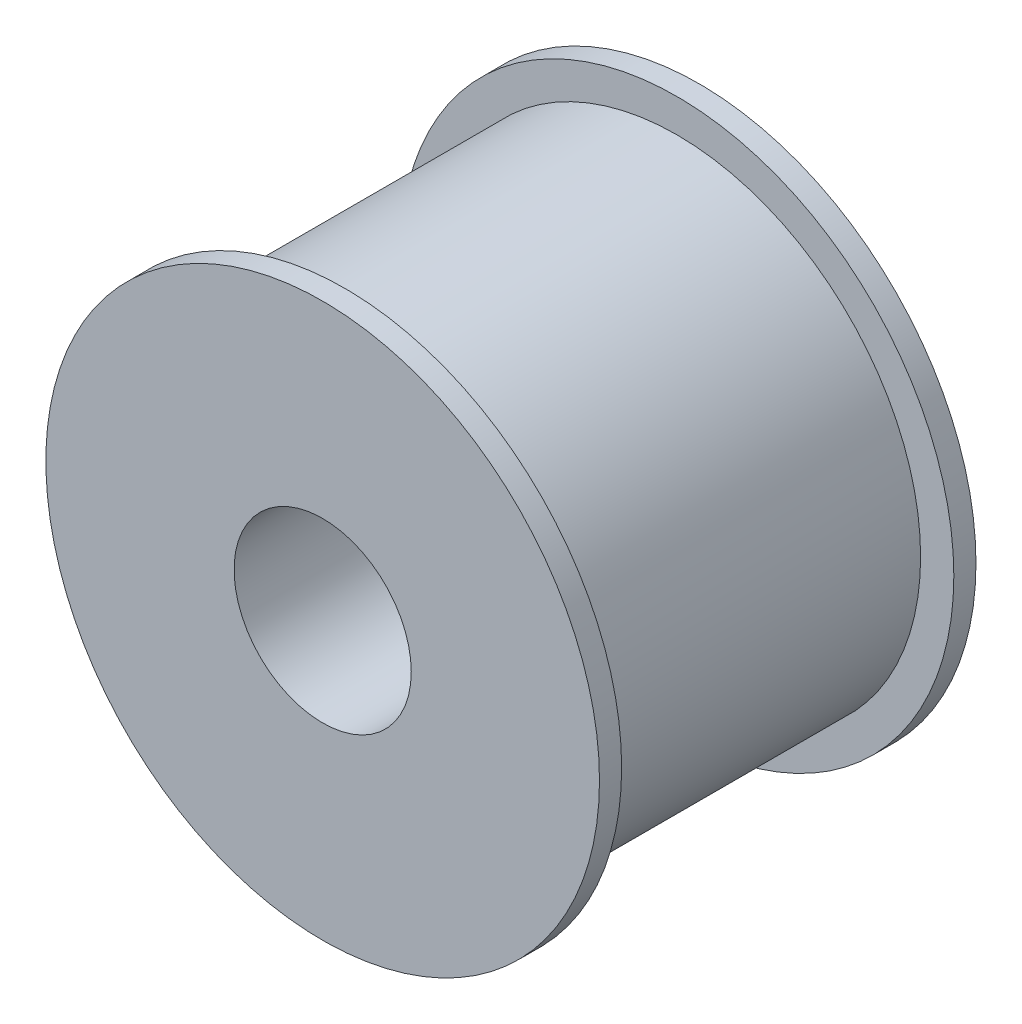
ISO-10303-21;
HEADER;
FILE_DESCRIPTION(('STEP AP214'),'2;1');
FILE_NAME('part.step','',(''),(''),'','','');
FILE_SCHEMA(('AUTOMOTIVE_DESIGN { 1 0 10303 214 1 1 1 1 }'));
ENDSEC;
DATA;
#1=APPLICATION_CONTEXT('core data for automotive mechanical design processes');
#2=APPLICATION_PROTOCOL_DEFINITION('international standard','automotive_design',2000,#1);
#3=PRODUCT_CONTEXT('',#1,'mechanical');
#4=PRODUCT('Part','Part','',(#3));
#5=PRODUCT_RELATED_PRODUCT_CATEGORY('part','',(#4));
#6=PRODUCT_DEFINITION_FORMATION('','',#4);
#7=PRODUCT_DEFINITION_CONTEXT('part definition',#1,'design');
#8=PRODUCT_DEFINITION('design','',#6,#7);
#9=PRODUCT_DEFINITION_SHAPE('','',#8);
#10=(LENGTH_UNIT() NAMED_UNIT(*) SI_UNIT(.MILLI.,.METRE.));
#11=(NAMED_UNIT(*) PLANE_ANGLE_UNIT() SI_UNIT($,.RADIAN.));
#12=(NAMED_UNIT(*) SI_UNIT($,.STERADIAN.) SOLID_ANGLE_UNIT());
#13=UNCERTAINTY_MEASURE_WITH_UNIT(LENGTH_MEASURE(1.E-05),#10,'distance_accuracy_value','');
#14=(GEOMETRIC_REPRESENTATION_CONTEXT(3) GLOBAL_UNCERTAINTY_ASSIGNED_CONTEXT((#13)) GLOBAL_UNIT_ASSIGNED_CONTEXT((#10,
#11,#12)) REPRESENTATION_CONTEXT('',''));
#15=CARTESIAN_POINT('',(0.,0.,0.));
#16=DIRECTION('',(0.,0.,1.));
#17=DIRECTION('',(1.,0.,0.));
#18=AXIS2_PLACEMENT_3D('',#15,#16,#17);
#19=CARTESIAN_POINT('',(0.,0.,8.));
#20=DIRECTION('',(0.,0.,-1.));
#21=DIRECTION('',(-1.,0.,0.));
#22=AXIS2_PLACEMENT_3D('',#19,#20,#21);
#23=CYLINDRICAL_SURFACE('',#22,11.);
#24=CARTESIAN_POINT('',(0.,0.,7.5));
#25=DIRECTION('',(0.,0.,1.));
#26=DIRECTION('',(1.,0.,0.));
#27=AXIS2_PLACEMENT_3D('',#24,#25,#26);
#28=CIRCLE('',#27,11.);
#29=CARTESIAN_POINT('',(11.,0.,7.5));
#30=VERTEX_POINT('',#29);
#31=EDGE_CURVE('E46',#30,#30,#28,.T.);
#32=ORIENTED_EDGE('',*,*,#31,.F.);
#33=EDGE_LOOP('',(#32));
#34=FACE_BOUND('',#33,.T.);
#35=CARTESIAN_POINT('',(0.,0.,-7.5));
#36=DIRECTION('',(0.,0.,-1.));
#37=DIRECTION('',(-1.,0.,0.));
#38=AXIS2_PLACEMENT_3D('',#35,#36,#37);
#39=CIRCLE('',#38,11.);
#40=CARTESIAN_POINT('',(-11.,0.,-7.5));
#41=VERTEX_POINT('',#40);
#42=EDGE_CURVE('E10',#41,#41,#39,.T.);
#43=ORIENTED_EDGE('',*,*,#42,.F.);
#44=EDGE_LOOP('',(#43));
#45=FACE_BOUND('',#44,.T.);
#46=ADVANCED_FACE('F43',(#34,#45),#23,.T.);
#47=CARTESIAN_POINT('',(0.,0.,8.));
#48=DIRECTION('',(0.,0.,-1.));
#49=DIRECTION('',(-1.,0.,0.));
#50=AXIS2_PLACEMENT_3D('',#47,#48,#49);
#51=CYLINDRICAL_SURFACE('',#50,4.);
#52=CARTESIAN_POINT('',(0.,0.,8.5));
#53=DIRECTION('',(0.,0.,1.));
#54=DIRECTION('',(1.,0.,0.));
#55=AXIS2_PLACEMENT_3D('',#52,#53,#54);
#56=CIRCLE('',#55,4.);
#57=CARTESIAN_POINT('',(4.,0.,8.5));
#58=VERTEX_POINT('',#57);
#59=EDGE_CURVE('E59',#58,#58,#56,.T.);
#60=ORIENTED_EDGE('',*,*,#59,.T.);
#61=EDGE_LOOP('',(#60));
#62=FACE_BOUND('',#61,.T.);
#63=CARTESIAN_POINT('',(0.,0.,-8.5));
#64=DIRECTION('',(0.,0.,1.));
#65=DIRECTION('',(1.,0.,0.));
#66=AXIS2_PLACEMENT_3D('',#63,#64,#65);
#67=CIRCLE('',#66,4.);
#68=CARTESIAN_POINT('',(4.,0.,-8.5));
#69=VERTEX_POINT('',#68);
#70=EDGE_CURVE('E110',#69,#69,#67,.T.);
#71=ORIENTED_EDGE('',*,*,#70,.F.);
#72=EDGE_LOOP('',(#71));
#73=FACE_BOUND('',#72,.T.);
#74=ADVANCED_FACE('F74',(#62,#73),#51,.F.);
#75=CARTESIAN_POINT('',(0.,0.,7.5));
#76=DIRECTION('',(0.,0.,1.));
#77=DIRECTION('',(1.,0.,0.));
#78=AXIS2_PLACEMENT_3D('',#75,#76,#77);
#79=PLANE('',#78);
#80=CARTESIAN_POINT('',(0.,0.,7.5));
#81=DIRECTION('',(0.,0.,1.));
#82=DIRECTION('',(1.,0.,0.));
#83=AXIS2_PLACEMENT_3D('',#80,#81,#82);
#84=CIRCLE('',#83,12.5);
#85=CARTESIAN_POINT('',(12.5,0.,7.5));
#86=VERTEX_POINT('',#85);
#87=EDGE_CURVE('E62',#86,#86,#84,.T.);
#88=ORIENTED_EDGE('',*,*,#87,.F.);
#89=EDGE_LOOP('',(#88));
#90=FACE_BOUND('',#89,.T.);
#91=ORIENTED_EDGE('',*,*,#31,.T.);
#92=EDGE_LOOP('',(#91));
#93=FACE_BOUND('',#92,.T.);
#94=ADVANCED_FACE('F70',(#90,#93),#79,.F.);
#95=CARTESIAN_POINT('',(0.,0.,8.5));
#96=DIRECTION('',(0.,0.,1.));
#97=DIRECTION('',(1.,0.,0.));
#98=AXIS2_PLACEMENT_3D('',#95,#96,#97);
#99=PLANE('',#98);
#100=CARTESIAN_POINT('',(0.,0.,8.5));
#101=DIRECTION('',(0.,0.,1.));
#102=DIRECTION('',(1.,0.,0.));
#103=AXIS2_PLACEMENT_3D('',#100,#101,#102);
#104=CIRCLE('',#103,12.5);
#105=CARTESIAN_POINT('',(12.5,0.,8.5));
#106=VERTEX_POINT('',#105);
#107=EDGE_CURVE('E54',#106,#106,#104,.T.);
#108=ORIENTED_EDGE('',*,*,#107,.T.);
#109=EDGE_LOOP('',(#108));
#110=FACE_BOUND('',#109,.T.);
#111=ORIENTED_EDGE('',*,*,#59,.F.);
#112=EDGE_LOOP('',(#111));
#113=FACE_BOUND('',#112,.T.);
#114=ADVANCED_FACE('F73',(#110,#113),#99,.T.);
#115=CARTESIAN_POINT('',(0.,0.,8.5));
#116=DIRECTION('',(0.,0.,-1.));
#117=DIRECTION('',(-1.,0.,0.));
#118=AXIS2_PLACEMENT_3D('',#115,#116,#117);
#119=CYLINDRICAL_SURFACE('',#118,12.5);
#120=ORIENTED_EDGE('',*,*,#107,.F.);
#121=EDGE_LOOP('',(#120));
#122=FACE_BOUND('',#121,.T.);
#123=ORIENTED_EDGE('',*,*,#87,.T.);
#124=EDGE_LOOP('',(#123));
#125=FACE_BOUND('',#124,.T.);
#126=ADVANCED_FACE('F68',(#122,#125),#119,.T.);
#127=CARTESIAN_POINT('',(0.,0.,-7.5));
#128=DIRECTION('',(0.,0.,-1.));
#129=DIRECTION('',(1.,0.,0.));
#130=AXIS2_PLACEMENT_3D('',#127,#128,#129);
#131=PLANE('',#130);
#132=CARTESIAN_POINT('',(0.,0.,-7.5));
#133=DIRECTION('',(0.,0.,1.));
#134=DIRECTION('',(1.,0.,0.));
#135=AXIS2_PLACEMENT_3D('',#132,#133,#134);
#136=CIRCLE('',#135,12.5);
#137=CARTESIAN_POINT('',(12.5,0.,-7.5));
#138=VERTEX_POINT('',#137);
#139=EDGE_CURVE('E57',#138,#138,#136,.T.);
#140=ORIENTED_EDGE('',*,*,#139,.T.);
#141=EDGE_LOOP('',(#140));
#142=FACE_BOUND('',#141,.T.);
#143=ORIENTED_EDGE('',*,*,#42,.T.);
#144=EDGE_LOOP('',(#143));
#145=FACE_BOUND('',#144,.T.);
#146=ADVANCED_FACE('F89',(#142,#145),#131,.F.);
#147=CARTESIAN_POINT('',(0.,0.,-8.5));
#148=DIRECTION('',(0.,0.,1.));
#149=DIRECTION('',(1.,0.,0.));
#150=AXIS2_PLACEMENT_3D('',#147,#148,#149);
#151=CYLINDRICAL_SURFACE('',#150,12.5);
#152=CARTESIAN_POINT('',(0.,0.,-8.5));
#153=DIRECTION('',(0.,0.,1.));
#154=DIRECTION('',(1.,0.,0.));
#155=AXIS2_PLACEMENT_3D('',#152,#153,#154);
#156=CIRCLE('',#155,12.5);
#157=CARTESIAN_POINT('',(12.5,0.,-8.5));
#158=VERTEX_POINT('',#157);
#159=EDGE_CURVE('E63',#158,#158,#156,.T.);
#160=ORIENTED_EDGE('',*,*,#159,.T.);
#161=EDGE_LOOP('',(#160));
#162=FACE_BOUND('',#161,.T.);
#163=ORIENTED_EDGE('',*,*,#139,.F.);
#164=EDGE_LOOP('',(#163));
#165=FACE_BOUND('',#164,.T.);
#166=ADVANCED_FACE('F95',(#162,#165),#151,.T.);
#167=CARTESIAN_POINT('',(0.,0.,-8.5));
#168=DIRECTION('',(0.,0.,-1.));
#169=DIRECTION('',(1.,0.,0.));
#170=AXIS2_PLACEMENT_3D('',#167,#168,#169);
#171=PLANE('',#170);
#172=ORIENTED_EDGE('',*,*,#70,.T.);
#173=EDGE_LOOP('',(#172));
#174=FACE_BOUND('',#173,.T.);
#175=ORIENTED_EDGE('',*,*,#159,.F.);
#176=EDGE_LOOP('',(#175));
#177=FACE_BOUND('',#176,.T.);
#178=ADVANCED_FACE('F98',(#174,#177),#171,.T.);
#179=CLOSED_SHELL('',(#46,#74,#94,#114,#126,#146,#166,#178));
#180=MANIFOLD_SOLID_BREP('B2',#179);
#181=ADVANCED_BREP_SHAPE_REPRESENTATION('',(#18,#180),#14);
#182=SHAPE_DEFINITION_REPRESENTATION(#9,#181);
ENDSEC;
END-ISO-10303-21;
